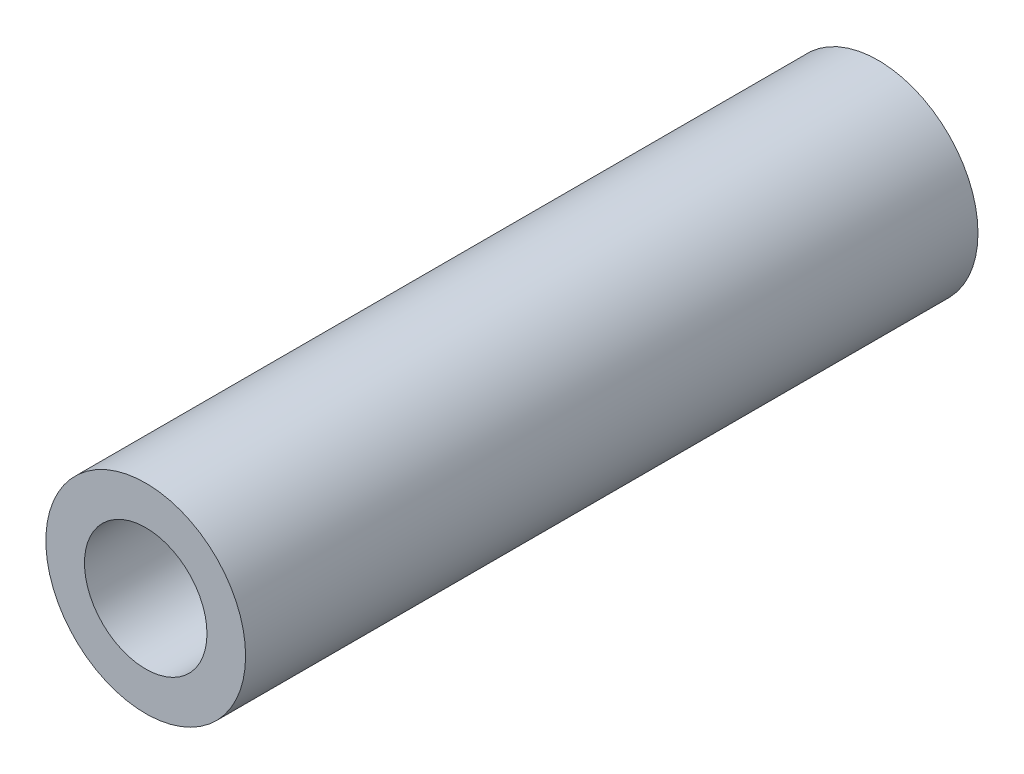
ISO-10303-21;
HEADER;
FILE_DESCRIPTION(('STEP AP214'),'2;1');
FILE_NAME('part.step','',(''),(''),'','','');
FILE_SCHEMA(('AUTOMOTIVE_DESIGN { 1 0 10303 214 1 1 1 1 }'));
ENDSEC;
DATA;
#1=APPLICATION_CONTEXT('core data for automotive mechanical design processes');
#2=APPLICATION_PROTOCOL_DEFINITION('international standard','automotive_design',2000,#1);
#3=PRODUCT_CONTEXT('',#1,'mechanical');
#4=PRODUCT('Part','Part','',(#3));
#5=PRODUCT_RELATED_PRODUCT_CATEGORY('part','',(#4));
#6=PRODUCT_DEFINITION_FORMATION('','',#4);
#7=PRODUCT_DEFINITION_CONTEXT('part definition',#1,'design');
#8=PRODUCT_DEFINITION('design','',#6,#7);
#9=PRODUCT_DEFINITION_SHAPE('','',#8);
#10=(LENGTH_UNIT() NAMED_UNIT(*) SI_UNIT(.MILLI.,.METRE.));
#11=(NAMED_UNIT(*) PLANE_ANGLE_UNIT() SI_UNIT($,.RADIAN.));
#12=(NAMED_UNIT(*) SI_UNIT($,.STERADIAN.) SOLID_ANGLE_UNIT());
#13=UNCERTAINTY_MEASURE_WITH_UNIT(LENGTH_MEASURE(1.E-05),#10,'distance_accuracy_value','');
#14=(GEOMETRIC_REPRESENTATION_CONTEXT(3) GLOBAL_UNCERTAINTY_ASSIGNED_CONTEXT((#13)) GLOBAL_UNIT_ASSIGNED_CONTEXT((#10,
#11,#12)) REPRESENTATION_CONTEXT('',''));
#15=CARTESIAN_POINT('',(0.,0.,0.));
#16=DIRECTION('',(0.,0.,1.));
#17=DIRECTION('',(1.,0.,0.));
#18=AXIS2_PLACEMENT_3D('',#15,#16,#17);
#19=CARTESIAN_POINT('',(0.,0.,8.73125));
#20=DIRECTION('',(0.,0.,1.));
#21=DIRECTION('',(1.,0.,0.));
#22=AXIS2_PLACEMENT_3D('',#19,#20,#21);
#23=PLANE('',#22);
#24=CARTESIAN_POINT('',(0.,0.,8.73125));
#25=DIRECTION('',(0.,0.,1.));
#26=DIRECTION('',(1.,0.,0.));
#27=AXIS2_PLACEMENT_3D('',#24,#25,#26);
#28=CIRCLE('',#27,2.38125);
#29=CARTESIAN_POINT('',(2.38125,0.,8.73125));
#30=VERTEX_POINT('',#29);
#31=EDGE_CURVE('E12',#30,#30,#28,.T.);
#32=ORIENTED_EDGE('',*,*,#31,.T.);
#33=EDGE_LOOP('',(#32));
#34=FACE_BOUND('',#33,.T.);
#35=CARTESIAN_POINT('',(0.,0.,8.73125));
#36=DIRECTION('',(0.,0.,1.));
#37=DIRECTION('',(1.,0.,0.));
#38=AXIS2_PLACEMENT_3D('',#35,#36,#37);
#39=CIRCLE('',#38,1.4605);
#40=CARTESIAN_POINT('',(1.4605,0.,8.73125));
#41=VERTEX_POINT('',#40);
#42=EDGE_CURVE('E55',#41,#41,#39,.T.);
#43=ORIENTED_EDGE('',*,*,#42,.F.);
#44=EDGE_LOOP('',(#43));
#45=FACE_BOUND('',#44,.T.);
#46=ADVANCED_FACE('F44',(#34,#45),#23,.T.);
#47=CARTESIAN_POINT('',(0.,0.,-8.73125));
#48=DIRECTION('',(0.,0.,1.));
#49=DIRECTION('',(1.,0.,0.));
#50=AXIS2_PLACEMENT_3D('',#47,#48,#49);
#51=PLANE('',#50);
#52=CARTESIAN_POINT('',(0.,0.,-8.73125));
#53=DIRECTION('',(0.,0.,1.));
#54=DIRECTION('',(1.,0.,0.));
#55=AXIS2_PLACEMENT_3D('',#52,#53,#54);
#56=CIRCLE('',#55,2.38125);
#57=CARTESIAN_POINT('',(2.38125,0.,-8.73125));
#58=VERTEX_POINT('',#57);
#59=EDGE_CURVE('E48',#58,#58,#56,.T.);
#60=ORIENTED_EDGE('',*,*,#59,.F.);
#61=EDGE_LOOP('',(#60));
#62=FACE_BOUND('',#61,.T.);
#63=CARTESIAN_POINT('',(0.,0.,-8.73125));
#64=DIRECTION('',(0.,0.,1.));
#65=DIRECTION('',(1.,0.,0.));
#66=AXIS2_PLACEMENT_3D('',#63,#64,#65);
#67=CIRCLE('',#66,1.4605);
#68=CARTESIAN_POINT('',(1.4605,0.,-8.73125));
#69=VERTEX_POINT('',#68);
#70=EDGE_CURVE('E57',#69,#69,#67,.T.);
#71=ORIENTED_EDGE('',*,*,#70,.T.);
#72=EDGE_LOOP('',(#71));
#73=FACE_BOUND('',#72,.T.);
#74=ADVANCED_FACE('F67',(#62,#73),#51,.F.);
#75=CARTESIAN_POINT('',(0.,0.,8.73125));
#76=DIRECTION('',(0.,0.,-1.));
#77=DIRECTION('',(-1.,0.,0.));
#78=AXIS2_PLACEMENT_3D('',#75,#76,#77);
#79=CYLINDRICAL_SURFACE('',#78,2.38125);
#80=ORIENTED_EDGE('',*,*,#31,.F.);
#81=EDGE_LOOP('',(#80));
#82=FACE_BOUND('',#81,.T.);
#83=ORIENTED_EDGE('',*,*,#59,.T.);
#84=EDGE_LOOP('',(#83));
#85=FACE_BOUND('',#84,.T.);
#86=ADVANCED_FACE('F46',(#82,#85),#79,.T.);
#87=CARTESIAN_POINT('',(0.,0.,8.73125));
#88=DIRECTION('',(0.,0.,-1.));
#89=DIRECTION('',(-1.,0.,0.));
#90=AXIS2_PLACEMENT_3D('',#87,#88,#89);
#91=CYLINDRICAL_SURFACE('',#90,1.4605);
#92=ORIENTED_EDGE('',*,*,#42,.T.);
#93=EDGE_LOOP('',(#92));
#94=FACE_BOUND('',#93,.T.);
#95=ORIENTED_EDGE('',*,*,#70,.F.);
#96=EDGE_LOOP('',(#95));
#97=FACE_BOUND('',#96,.T.);
#98=ADVANCED_FACE('F63',(#94,#97),#91,.F.);
#99=CLOSED_SHELL('',(#46,#74,#86,#98));
#100=MANIFOLD_SOLID_BREP('B2',#99);
#101=ADVANCED_BREP_SHAPE_REPRESENTATION('',(#18,#100),#14);
#102=SHAPE_DEFINITION_REPRESENTATION(#9,#101);
ENDSEC;
END-ISO-10303-21;
